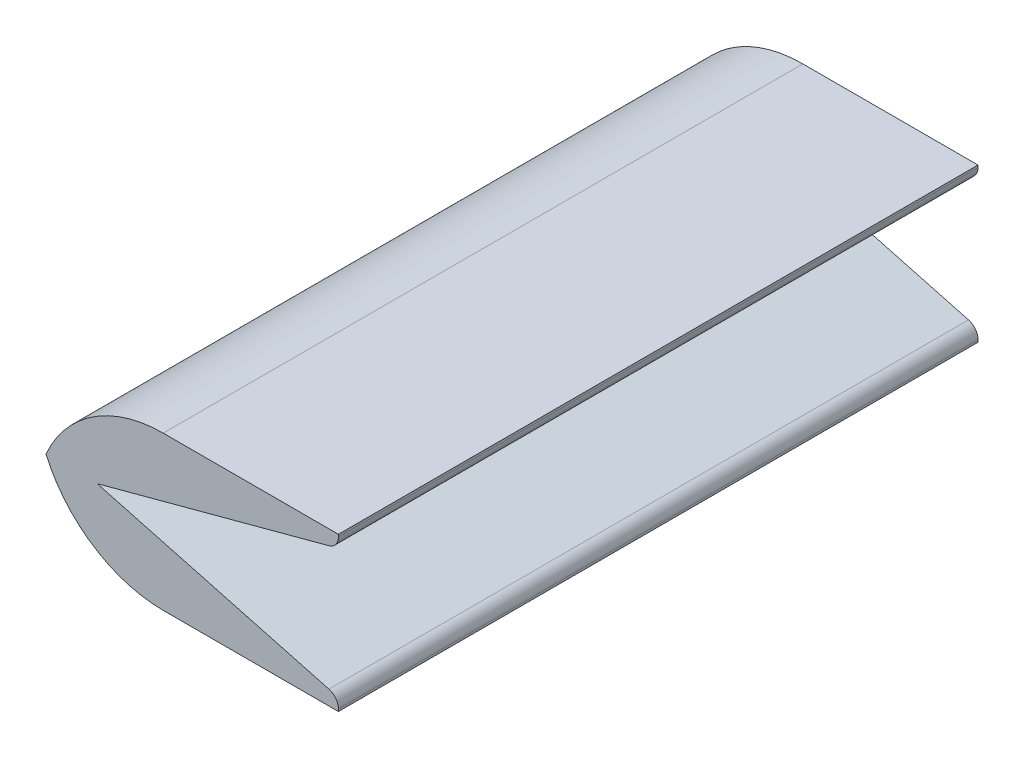
ISO-10303-21;
HEADER;
FILE_DESCRIPTION(('STEP AP214'),'2;1');
FILE_NAME('part.step','',(''),(''),'','','');
FILE_SCHEMA(('AUTOMOTIVE_DESIGN { 1 0 10303 214 1 1 1 1 }'));
ENDSEC;
DATA;
#1=APPLICATION_CONTEXT('core data for automotive mechanical design processes');
#2=APPLICATION_PROTOCOL_DEFINITION('international standard','automotive_design',2000,#1);
#3=PRODUCT_CONTEXT('',#1,'mechanical');
#4=PRODUCT('Part','Part','',(#3));
#5=PRODUCT_RELATED_PRODUCT_CATEGORY('part','',(#4));
#6=PRODUCT_DEFINITION_FORMATION('','',#4);
#7=PRODUCT_DEFINITION_CONTEXT('part definition',#1,'design');
#8=PRODUCT_DEFINITION('design','',#6,#7);
#9=PRODUCT_DEFINITION_SHAPE('','',#8);
#10=(LENGTH_UNIT() NAMED_UNIT(*) SI_UNIT(.MILLI.,.METRE.));
#11=(NAMED_UNIT(*) PLANE_ANGLE_UNIT() SI_UNIT($,.RADIAN.));
#12=(NAMED_UNIT(*) SI_UNIT($,.STERADIAN.) SOLID_ANGLE_UNIT());
#13=UNCERTAINTY_MEASURE_WITH_UNIT(LENGTH_MEASURE(1.E-05),#10,'distance_accuracy_value','');
#14=(GEOMETRIC_REPRESENTATION_CONTEXT(3) GLOBAL_UNCERTAINTY_ASSIGNED_CONTEXT((#13)) GLOBAL_UNIT_ASSIGNED_CONTEXT((#10,
#11,#12)) REPRESENTATION_CONTEXT('',''));
#15=CARTESIAN_POINT('',(0.,0.,0.));
#16=DIRECTION('',(0.,0.,1.));
#17=DIRECTION('',(1.,0.,0.));
#18=AXIS2_PLACEMENT_3D('',#15,#16,#17);
#19=CARTESIAN_POINT('',(0.870590477448727,3.24908789442434,50.));
#20=DIRECTION('',(0.258819045102517,0.965925826289069,0.));
#21=DIRECTION('',(-0.965925826289069,0.258819045102517,0.));
#22=AXIS2_PLACEMENT_3D('',#19,#20,#21);
#23=PLANE('',#22);
#24=DIRECTION('',(0.965925826289069,-0.258819045102517,0.));
#25=VECTOR('',#24,1.);
#26=CARTESIAN_POINT('',(0.870590477448727,3.24908789442434,50.));
#27=LINE('',#26,#25);
#28=CARTESIAN_POINT('',(-1.93185165257819,4.,50.));
#29=VERTEX_POINT('',#28);
#30=CARTESIAN_POINT('',(16.1870222753782,-0.854937636757169,50.));
#31=VERTEX_POINT('',#30);
#32=EDGE_CURVE('E225',#29,#31,#27,.T.);
#33=ORIENTED_EDGE('',*,*,#32,.T.);
#34=DIRECTION('',(0.,0.,-1.));
#35=VECTOR('',#34,1.);
#36=CARTESIAN_POINT('',(16.1870222753782,-0.854937636757169,0.));
#37=LINE('',#36,#35);
#38=CARTESIAN_POINT('',(16.1870222753782,-0.854937636757169,0.));
#39=VERTEX_POINT('',#38);
#40=EDGE_CURVE('E284',#31,#39,#37,.T.);
#41=ORIENTED_EDGE('',*,*,#40,.T.);
#42=DIRECTION('',(0.965925826289069,-0.258819045102517,0.));
#43=VECTOR('',#42,1.);
#44=CARTESIAN_POINT('',(0.870590477448727,3.24908789442434,0.));
#45=LINE('',#44,#43);
#46=CARTESIAN_POINT('',(-1.93185165257819,4.,0.));
#47=VERTEX_POINT('',#46);
#48=EDGE_CURVE('E224',#47,#39,#45,.T.);
#49=ORIENTED_EDGE('',*,*,#48,.F.);
#50=DIRECTION('',(0.,0.,-1.));
#51=VECTOR('',#50,1.);
#52=CARTESIAN_POINT('',(-1.93185165257819,4.,50.));
#53=LINE('',#52,#51);
#54=CARTESIAN_POINT('',(-1.93185165257819,4.,17.5));
#55=VERTEX_POINT('',#54);
#56=EDGE_CURVE('E257',#55,#47,#53,.T.);
#57=ORIENTED_EDGE('',*,*,#56,.F.);
#58=DIRECTION('',(-0.965925826289069,0.258819045102517,0.));
#59=VECTOR('',#58,1.);
#60=CARTESIAN_POINT('',(0.870590477448727,3.24908789442434,17.5));
#61=LINE('',#60,#59);
#62=CARTESIAN_POINT('',(0.867186453098469,3.25000000000001,17.5));
#63=VERTEX_POINT('',#62);
#64=EDGE_CURVE('E205',#63,#55,#61,.T.);
#65=ORIENTED_EDGE('',*,*,#64,.F.);
#66=DIRECTION('',(0.,0.,-1.));
#67=VECTOR('',#66,1.);
#68=CARTESIAN_POINT('',(0.867186453098493,3.25,50.));
#69=LINE('',#68,#67);
#70=CARTESIAN_POINT('',(0.867186453098469,3.25000000000001,32.5));
#71=VERTEX_POINT('',#70);
#72=EDGE_CURVE('E213',#71,#63,#69,.T.);
#73=ORIENTED_EDGE('',*,*,#72,.F.);
#74=DIRECTION('',(-0.965925826289069,0.258819045102517,0.));
#75=VECTOR('',#74,1.);
#76=CARTESIAN_POINT('',(0.870590477448727,3.24908789442434,32.5));
#77=LINE('',#76,#75);
#78=CARTESIAN_POINT('',(-1.93185165257819,4.,32.5));
#79=VERTEX_POINT('',#78);
#80=EDGE_CURVE('E219',#71,#79,#77,.T.);
#81=ORIENTED_EDGE('',*,*,#80,.T.);
#82=EDGE_CURVE('E258',#29,#79,#53,.T.);
#83=ORIENTED_EDGE('',*,*,#82,.F.);
#84=EDGE_LOOP('',(#33,#41,#49,#57,#65,#73,#81,#83));
#85=FACE_BOUND('',#84,.T.);
#86=ADVANCED_FACE('F74',(#85),#23,.T.);
#87=CARTESIAN_POINT('',(-1.12940952255125,4.21501372071343,50.));
#88=DIRECTION('',(-0.258819045102518,0.965925826289069,0.));
#89=DIRECTION('',(-0.965925826289069,-0.258819045102518,0.));
#90=AXIS2_PLACEMENT_3D('',#87,#88,#89);
#91=PLANE('',#90);
#92=DIRECTION('',(0.965925826289069,0.258819045102518,0.));
#93=VECTOR('',#92,1.);
#94=CARTESIAN_POINT('',(-1.12940952255125,4.21501372071343,0.));
#95=LINE('',#94,#93);
#96=CARTESIAN_POINT('',(16.1870222753782,8.85493763675719,0.));
#97=VERTEX_POINT('',#96);
#98=EDGE_CURVE('E242',#47,#97,#95,.T.);
#99=ORIENTED_EDGE('',*,*,#98,.T.);
#100=DIRECTION('',(0.,0.,-1.));
#101=VECTOR('',#100,1.);
#102=CARTESIAN_POINT('',(16.1870222753782,8.85493763675719,50.));
#103=LINE('',#102,#101);
#104=CARTESIAN_POINT('',(16.1870222753782,8.85493763675719,50.));
#105=VERTEX_POINT('',#104);
#106=EDGE_CURVE('E12',#97,#105,#103,.F.);
#107=ORIENTED_EDGE('',*,*,#106,.T.);
#108=DIRECTION('',(0.965925826289069,0.258819045102518,0.));
#109=VECTOR('',#108,1.);
#110=CARTESIAN_POINT('',(-1.12940952255125,4.21501372071343,50.));
#111=LINE('',#110,#109);
#112=EDGE_CURVE('E228',#29,#105,#111,.T.);
#113=ORIENTED_EDGE('',*,*,#112,.F.);
#114=ORIENTED_EDGE('',*,*,#82,.T.);
#115=DIRECTION('',(-0.965925826289069,-0.258819045102518,0.));
#116=VECTOR('',#115,1.);
#117=CARTESIAN_POINT('',(-1.12940952255125,4.21501372071343,32.5));
#118=LINE('',#117,#116);
#119=CARTESIAN_POINT('',(0.867186453098504,4.75,32.5));
#120=VERTEX_POINT('',#119);
#121=EDGE_CURVE('E211',#120,#79,#118,.T.);
#122=ORIENTED_EDGE('',*,*,#121,.F.);
#123=DIRECTION('',(0.,0.,1.));
#124=VECTOR('',#123,1.);
#125=CARTESIAN_POINT('',(0.867186453098506,4.75,50.));
#126=LINE('',#125,#124);
#127=CARTESIAN_POINT('',(0.867186453098477,4.75,17.5));
#128=VERTEX_POINT('',#127);
#129=EDGE_CURVE('E192',#128,#120,#126,.T.);
#130=ORIENTED_EDGE('',*,*,#129,.F.);
#131=DIRECTION('',(-0.965925826289069,-0.258819045102518,0.));
#132=VECTOR('',#131,1.);
#133=CARTESIAN_POINT('',(-1.12940952255125,4.21501372071343,17.5));
#134=LINE('',#133,#132);
#135=EDGE_CURVE('E202',#128,#55,#134,.T.);
#136=ORIENTED_EDGE('',*,*,#135,.T.);
#137=ORIENTED_EDGE('',*,*,#56,.T.);
#138=EDGE_LOOP('',(#99,#107,#113,#114,#122,#130,#136,#137));
#139=FACE_BOUND('',#138,.T.);
#140=ADVANCED_FACE('F209',(#139),#91,.F.);
#141=CARTESIAN_POINT('',(0.,0.,0.));
#142=DIRECTION('',(0.,0.,1.));
#143=DIRECTION('',(1.,0.,0.));
#144=AXIS2_PLACEMENT_3D('',#141,#142,#143);
#145=PLANE('',#144);
#146=ORIENTED_EDGE('',*,*,#48,.T.);
#147=CARTESIAN_POINT('',(15.9282032302757,-1.82086346304624,0.));
#148=DIRECTION('',(0.,0.,1.));
#149=DIRECTION('',(1.,0.,0.));
#150=AXIS2_PLACEMENT_3D('',#147,#148,#149);
#151=CIRCLE('',#150,1.);
#152=CARTESIAN_POINT('',(16.9282032302757,-1.82086346304624,0.));
#153=VERTEX_POINT('',#152);
#154=EDGE_CURVE('E289',#39,#153,#151,.F.);
#155=ORIENTED_EDGE('',*,*,#154,.T.);
#156=DIRECTION('',(0.,1.,0.));
#157=VECTOR('',#156,1.);
#158=CARTESIAN_POINT('',(16.9282032302757,0.,0.));
#159=LINE('',#158,#157);
#160=CARTESIAN_POINT('',(16.9282032302757,-2.,0.));
#161=VERTEX_POINT('',#160);
#162=EDGE_CURVE('E229',#161,#153,#159,.T.);
#163=ORIENTED_EDGE('',*,*,#162,.F.);
#164=DIRECTION('',(-1.,0.,0.));
#165=VECTOR('',#164,1.);
#166=CARTESIAN_POINT('',(0.,-2.,0.));
#167=LINE('',#166,#165);
#168=CARTESIAN_POINT('',(3.23329973733349,-2.,0.));
#169=VERTEX_POINT('',#168);
#170=EDGE_CURVE('E249',#161,#169,#167,.T.);
#171=ORIENTED_EDGE('',*,*,#170,.T.);
#172=CARTESIAN_POINT('',(3.23329973733349,8.,0.));
#173=DIRECTION('',(0.,0.,1.));
#174=DIRECTION('',(1.,0.,0.));
#175=AXIS2_PLACEMENT_3D('',#172,#173,#174);
#176=CIRCLE('',#175,10.);
#177=CARTESIAN_POINT('',(-5.93185165257819,4.,0.));
#178=VERTEX_POINT('',#177);
#179=EDGE_CURVE('E274',#169,#178,#176,.F.);
#180=ORIENTED_EDGE('',*,*,#179,.T.);
#181=CARTESIAN_POINT('',(3.23329973733349,0.,0.));
#182=DIRECTION('',(0.,0.,1.));
#183=DIRECTION('',(1.,0.,0.));
#184=AXIS2_PLACEMENT_3D('',#181,#182,#183);
#185=CIRCLE('',#184,10.);
#186=CARTESIAN_POINT('',(3.23329973733349,10.,0.));
#187=VERTEX_POINT('',#186);
#188=EDGE_CURVE('E265',#178,#187,#185,.F.);
#189=ORIENTED_EDGE('',*,*,#188,.T.);
#190=DIRECTION('',(-1.,0.,0.));
#191=VECTOR('',#190,1.);
#192=CARTESIAN_POINT('',(0.,10.,0.));
#193=LINE('',#192,#191);
#194=CARTESIAN_POINT('',(16.9282032302757,10.,0.));
#195=VERTEX_POINT('',#194);
#196=EDGE_CURVE('E246',#195,#187,#193,.T.);
#197=ORIENTED_EDGE('',*,*,#196,.F.);
#198=CARTESIAN_POINT('',(16.9282032302757,9.82086346304625,0.));
#199=VERTEX_POINT('',#198);
#200=EDGE_CURVE('E244',#199,#195,#159,.T.);
#201=ORIENTED_EDGE('',*,*,#200,.F.);
#202=CARTESIAN_POINT('',(15.9282032302757,9.82086346304625,0.));
#203=DIRECTION('',(0.,0.,1.));
#204=DIRECTION('',(1.,0.,0.));
#205=AXIS2_PLACEMENT_3D('',#202,#203,#204);
#206=CIRCLE('',#205,1.);
#207=EDGE_CURVE('E287',#199,#97,#206,.F.);
#208=ORIENTED_EDGE('',*,*,#207,.T.);
#209=ORIENTED_EDGE('',*,*,#98,.F.);
#210=EDGE_LOOP('',(#146,#155,#163,#171,#180,#189,#197,#201,#208,#209));
#211=FACE_BOUND('',#210,.T.);
#212=ADVANCED_FACE('F304',(#211),#145,.F.);
#213=CARTESIAN_POINT('',(0.,-2.,50.));
#214=DIRECTION('',(0.,-1.,0.));
#215=DIRECTION('',(1.,0.,0.));
#216=AXIS2_PLACEMENT_3D('',#213,#214,#215);
#217=PLANE('',#216);
#218=DIRECTION('',(-1.,0.,0.));
#219=VECTOR('',#218,1.);
#220=CARTESIAN_POINT('',(0.,-2.,50.));
#221=LINE('',#220,#219);
#222=CARTESIAN_POINT('',(16.9282032302757,-2.,50.));
#223=VERTEX_POINT('',#222);
#224=CARTESIAN_POINT('',(3.23329973733349,-2.,50.));
#225=VERTEX_POINT('',#224);
#226=EDGE_CURVE('E237',#223,#225,#221,.T.);
#227=ORIENTED_EDGE('',*,*,#226,.T.);
#228=DIRECTION('',(0.,0.,-1.));
#229=VECTOR('',#228,1.);
#230=CARTESIAN_POINT('',(3.23329973733349,-2.,0.));
#231=LINE('',#230,#229);
#232=EDGE_CURVE('E271',#225,#169,#231,.T.);
#233=ORIENTED_EDGE('',*,*,#232,.T.);
#234=ORIENTED_EDGE('',*,*,#170,.F.);
#235=DIRECTION('',(0.,0.,-1.));
#236=VECTOR('',#235,1.);
#237=CARTESIAN_POINT('',(16.9282032302757,-2.,50.));
#238=LINE('',#237,#236);
#239=EDGE_CURVE('E252',#223,#161,#238,.T.);
#240=ORIENTED_EDGE('',*,*,#239,.F.);
#241=EDGE_LOOP('',(#227,#233,#234,#240));
#242=FACE_BOUND('',#241,.T.);
#243=ADVANCED_FACE('F324',(#242),#217,.T.);
#244=CARTESIAN_POINT('',(0.,10.,50.));
#245=DIRECTION('',(0.,-1.,0.));
#246=DIRECTION('',(0.,0.,-1.));
#247=AXIS2_PLACEMENT_3D('',#244,#245,#246);
#248=PLANE('',#247);
#249=ORIENTED_EDGE('',*,*,#196,.T.);
#250=DIRECTION('',(0.,0.,1.));
#251=VECTOR('',#250,1.);
#252=CARTESIAN_POINT('',(3.23329973733349,10.,50.));
#253=LINE('',#252,#251);
#254=CARTESIAN_POINT('',(3.23329973733349,10.,50.));
#255=VERTEX_POINT('',#254);
#256=EDGE_CURVE('E267',#187,#255,#253,.T.);
#257=ORIENTED_EDGE('',*,*,#256,.T.);
#258=DIRECTION('',(-1.,0.,0.));
#259=VECTOR('',#258,1.);
#260=CARTESIAN_POINT('',(0.,10.,50.));
#261=LINE('',#260,#259);
#262=CARTESIAN_POINT('',(16.9282032302757,10.,50.));
#263=VERTEX_POINT('',#262);
#264=EDGE_CURVE('E233',#263,#255,#261,.T.);
#265=ORIENTED_EDGE('',*,*,#264,.F.);
#266=DIRECTION('',(0.,0.,-1.));
#267=VECTOR('',#266,1.);
#268=CARTESIAN_POINT('',(16.9282032302757,10.,50.));
#269=LINE('',#268,#267);
#270=EDGE_CURVE('E254',#263,#195,#269,.T.);
#271=ORIENTED_EDGE('',*,*,#270,.T.);
#272=EDGE_LOOP('',(#249,#257,#265,#271));
#273=FACE_BOUND('',#272,.T.);
#274=ADVANCED_FACE('F309',(#273),#248,.F.);
#275=CARTESIAN_POINT('',(0.,0.,50.));
#276=DIRECTION('',(0.,0.,1.));
#277=DIRECTION('',(1.,0.,0.));
#278=AXIS2_PLACEMENT_3D('',#275,#276,#277);
#279=PLANE('',#278);
#280=DIRECTION('',(0.,1.,0.));
#281=VECTOR('',#280,1.);
#282=CARTESIAN_POINT('',(16.9282032302757,0.,50.));
#283=LINE('',#282,#281);
#284=CARTESIAN_POINT('',(16.9282032302757,-1.82086346304624,50.));
#285=VERTEX_POINT('',#284);
#286=EDGE_CURVE('E234',#223,#285,#283,.T.);
#287=ORIENTED_EDGE('',*,*,#286,.T.);
#288=CARTESIAN_POINT('',(15.9282032302757,-1.82086346304624,50.));
#289=DIRECTION('',(0.,0.,1.));
#290=DIRECTION('',(1.,0.,0.));
#291=AXIS2_PLACEMENT_3D('',#288,#289,#290);
#292=CIRCLE('',#291,1.);
#293=EDGE_CURVE('E294',#285,#31,#292,.T.);
#294=ORIENTED_EDGE('',*,*,#293,.T.);
#295=ORIENTED_EDGE('',*,*,#32,.F.);
#296=ORIENTED_EDGE('',*,*,#112,.T.);
#297=CARTESIAN_POINT('',(15.9282032302757,9.82086346304625,50.));
#298=DIRECTION('',(0.,0.,1.));
#299=DIRECTION('',(1.,0.,0.));
#300=AXIS2_PLACEMENT_3D('',#297,#298,#299);
#301=CIRCLE('',#300,1.);
#302=CARTESIAN_POINT('',(16.9282032302757,9.82086346304625,50.));
#303=VERTEX_POINT('',#302);
#304=EDGE_CURVE('E89',#105,#303,#301,.T.);
#305=ORIENTED_EDGE('',*,*,#304,.T.);
#306=EDGE_CURVE('E231',#303,#263,#283,.T.);
#307=ORIENTED_EDGE('',*,*,#306,.T.);
#308=ORIENTED_EDGE('',*,*,#264,.T.);
#309=CARTESIAN_POINT('',(3.23329973733349,0.,50.));
#310=DIRECTION('',(0.,0.,1.));
#311=DIRECTION('',(1.,0.,0.));
#312=AXIS2_PLACEMENT_3D('',#309,#310,#311);
#313=CIRCLE('',#312,10.);
#314=CARTESIAN_POINT('',(-5.93185165257819,4.,50.));
#315=VERTEX_POINT('',#314);
#316=EDGE_CURVE('E269',#255,#315,#313,.T.);
#317=ORIENTED_EDGE('',*,*,#316,.T.);
#318=CARTESIAN_POINT('',(3.23329973733349,8.,50.));
#319=DIRECTION('',(0.,0.,1.));
#320=DIRECTION('',(1.,0.,0.));
#321=AXIS2_PLACEMENT_3D('',#318,#319,#320);
#322=CIRCLE('',#321,10.);
#323=EDGE_CURVE('E282',#315,#225,#322,.T.);
#324=ORIENTED_EDGE('',*,*,#323,.T.);
#325=ORIENTED_EDGE('',*,*,#226,.F.);
#326=EDGE_LOOP('',(#287,#294,#295,#296,#305,#307,#308,#317,#324,#325));
#327=FACE_BOUND('',#326,.T.);
#328=ADVANCED_FACE('F319',(#327),#279,.T.);
#329=CARTESIAN_POINT('',(16.9282032302757,0.,50.));
#330=DIRECTION('',(-1.,0.,0.));
#331=DIRECTION('',(0.,0.,1.));
#332=AXIS2_PLACEMENT_3D('',#329,#330,#331);
#333=PLANE('',#332);
#334=ORIENTED_EDGE('',*,*,#162,.T.);
#335=DIRECTION('',(0.,0.,-1.));
#336=VECTOR('',#335,1.);
#337=CARTESIAN_POINT('',(16.9282032302757,-1.82086346304624,50.));
#338=LINE('',#337,#336);
#339=EDGE_CURVE('E291',#153,#285,#338,.F.);
#340=ORIENTED_EDGE('',*,*,#339,.T.);
#341=ORIENTED_EDGE('',*,*,#286,.F.);
#342=ORIENTED_EDGE('',*,*,#239,.T.);
#343=EDGE_LOOP('',(#334,#340,#341,#342));
#344=FACE_BOUND('',#343,.T.);
#345=ADVANCED_FACE('F333',(#344),#333,.F.);
#346=ORIENTED_EDGE('',*,*,#306,.F.);
#347=DIRECTION('',(0.,0.,-1.));
#348=VECTOR('',#347,1.);
#349=CARTESIAN_POINT('',(16.9282032302757,9.82086346304625,50.));
#350=LINE('',#349,#348);
#351=EDGE_CURVE('E82',#303,#199,#350,.T.);
#352=ORIENTED_EDGE('',*,*,#351,.T.);
#353=ORIENTED_EDGE('',*,*,#200,.T.);
#354=ORIENTED_EDGE('',*,*,#270,.F.);
#355=EDGE_LOOP('',(#346,#352,#353,#354));
#356=FACE_BOUND('',#355,.T.);
#357=ADVANCED_FACE('F299',(#356),#333,.F.);
#358=CARTESIAN_POINT('',(-5.93186365257819,4.75,0.));
#359=DIRECTION('',(0.,-1.,0.));
#360=DIRECTION('',(0.,0.,-1.));
#361=AXIS2_PLACEMENT_3D('',#358,#359,#360);
#362=PLANE('',#361);
#363=DIRECTION('',(1.,0.,0.));
#364=VECTOR('',#363,1.);
#365=CARTESIAN_POINT('',(-5.93186365257819,4.75,32.5));
#366=LINE('',#365,#364);
#367=CARTESIAN_POINT('',(-5.56655821606553,4.75,32.5));
#368=VERTEX_POINT('',#367);
#369=EDGE_CURVE('E198',#368,#120,#366,.T.);
#370=ORIENTED_EDGE('',*,*,#369,.F.);
#371=DIRECTION('',(0.,0.,1.));
#372=VECTOR('',#371,1.);
#373=CARTESIAN_POINT('',(-5.56655821606553,4.75,32.5));
#374=LINE('',#373,#372);
#375=CARTESIAN_POINT('',(-5.56655821606553,4.75,17.5));
#376=VERTEX_POINT('',#375);
#377=EDGE_CURVE('E195',#368,#376,#374,.F.);
#378=ORIENTED_EDGE('',*,*,#377,.T.);
#379=DIRECTION('',(1.,0.,0.));
#380=VECTOR('',#379,1.);
#381=CARTESIAN_POINT('',(-5.93186365257819,4.75,17.5));
#382=LINE('',#381,#380);
#383=EDGE_CURVE('E187',#376,#128,#382,.T.);
#384=ORIENTED_EDGE('',*,*,#383,.T.);
#385=ORIENTED_EDGE('',*,*,#129,.T.);
#386=EDGE_LOOP('',(#370,#378,#384,#385));
#387=FACE_BOUND('',#386,.T.);
#388=ADVANCED_FACE('F190',(#387),#362,.T.);
#389=CARTESIAN_POINT('',(-5.93186365257819,3.25,0.));
#390=DIRECTION('',(0.,-1.,0.));
#391=DIRECTION('',(0.,0.,-1.));
#392=AXIS2_PLACEMENT_3D('',#389,#390,#391);
#393=PLANE('',#392);
#394=DIRECTION('',(1.,0.,0.));
#395=VECTOR('',#394,1.);
#396=CARTESIAN_POINT('',(-5.93186365257819,3.25,17.5));
#397=LINE('',#396,#395);
#398=CARTESIAN_POINT('',(-5.56655821606554,3.25,17.5));
#399=VERTEX_POINT('',#398);
#400=EDGE_CURVE('E199',#399,#63,#397,.T.);
#401=ORIENTED_EDGE('',*,*,#400,.F.);
#402=DIRECTION('',(0.,0.,1.));
#403=VECTOR('',#402,1.);
#404=CARTESIAN_POINT('',(-5.56655821606554,3.25,17.5));
#405=LINE('',#404,#403);
#406=CARTESIAN_POINT('',(-5.56655821606553,3.25,32.5));
#407=VERTEX_POINT('',#406);
#408=EDGE_CURVE('E278',#399,#407,#405,.T.);
#409=ORIENTED_EDGE('',*,*,#408,.T.);
#410=DIRECTION('',(1.,0.,0.));
#411=VECTOR('',#410,1.);
#412=CARTESIAN_POINT('',(-5.93186365257819,3.25,32.5));
#413=LINE('',#412,#411);
#414=EDGE_CURVE('E207',#407,#71,#413,.T.);
#415=ORIENTED_EDGE('',*,*,#414,.T.);
#416=ORIENTED_EDGE('',*,*,#72,.T.);
#417=EDGE_LOOP('',(#401,#409,#415,#416));
#418=FACE_BOUND('',#417,.T.);
#419=ADVANCED_FACE('F382',(#418),#393,.F.);
#420=CARTESIAN_POINT('',(-5.93186365257819,0.,32.5));
#421=DIRECTION('',(0.,0.,-1.));
#422=DIRECTION('',(-1.,0.,0.));
#423=AXIS2_PLACEMENT_3D('',#420,#421,#422);
#424=PLANE('',#423);
#425=ORIENTED_EDGE('',*,*,#414,.F.);
#426=CARTESIAN_POINT('',(3.23329973733349,8.,32.5));
#427=DIRECTION('',(0.,0.,-1.));
#428=DIRECTION('',(-1.,0.,0.));
#429=AXIS2_PLACEMENT_3D('',#426,#427,#428);
#430=CIRCLE('',#429,10.);
#431=CARTESIAN_POINT('',(-5.93185165257819,4.,32.5));
#432=VERTEX_POINT('',#431);
#433=EDGE_CURVE('E280',#407,#432,#430,.T.);
#434=ORIENTED_EDGE('',*,*,#433,.T.);
#435=CARTESIAN_POINT('',(3.23329973733349,0.,32.5));
#436=DIRECTION('',(0.,0.,-1.));
#437=DIRECTION('',(-1.,0.,0.));
#438=AXIS2_PLACEMENT_3D('',#435,#436,#437);
#439=CIRCLE('',#438,10.);
#440=EDGE_CURVE('E260',#432,#368,#439,.T.);
#441=ORIENTED_EDGE('',*,*,#440,.T.);
#442=ORIENTED_EDGE('',*,*,#369,.T.);
#443=ORIENTED_EDGE('',*,*,#121,.T.);
#444=ORIENTED_EDGE('',*,*,#80,.F.);
#445=EDGE_LOOP('',(#425,#434,#441,#442,#443,#444));
#446=FACE_BOUND('',#445,.T.);
#447=ADVANCED_FACE('F374',(#446),#424,.T.);
#448=CARTESIAN_POINT('',(-5.93186365257819,0.,17.5));
#449=DIRECTION('',(0.,0.,-1.));
#450=DIRECTION('',(-1.,0.,0.));
#451=AXIS2_PLACEMENT_3D('',#448,#449,#450);
#452=PLANE('',#451);
#453=CARTESIAN_POINT('',(3.23329973733349,0.,17.5));
#454=DIRECTION('',(0.,0.,-1.));
#455=DIRECTION('',(-1.,0.,0.));
#456=AXIS2_PLACEMENT_3D('',#453,#454,#455);
#457=CIRCLE('',#456,10.);
#458=CARTESIAN_POINT('',(-5.93185165257819,4.,17.5));
#459=VERTEX_POINT('',#458);
#460=EDGE_CURVE('E263',#376,#459,#457,.F.);
#461=ORIENTED_EDGE('',*,*,#460,.T.);
#462=CARTESIAN_POINT('',(3.23329973733349,8.,17.5));
#463=DIRECTION('',(0.,0.,-1.));
#464=DIRECTION('',(-1.,0.,0.));
#465=AXIS2_PLACEMENT_3D('',#462,#463,#464);
#466=CIRCLE('',#465,10.);
#467=EDGE_CURVE('E276',#459,#399,#466,.F.);
#468=ORIENTED_EDGE('',*,*,#467,.T.);
#469=ORIENTED_EDGE('',*,*,#400,.T.);
#470=ORIENTED_EDGE('',*,*,#64,.T.);
#471=ORIENTED_EDGE('',*,*,#135,.F.);
#472=ORIENTED_EDGE('',*,*,#383,.F.);
#473=EDGE_LOOP('',(#461,#468,#469,#470,#471,#472));
#474=FACE_BOUND('',#473,.T.);
#475=ADVANCED_FACE('F203',(#474),#452,.F.);
#476=CARTESIAN_POINT('',(3.23329973733349,0.,0.));
#477=DIRECTION('',(0.,0.,1.));
#478=DIRECTION('',(1.,0.,0.));
#479=AXIS2_PLACEMENT_3D('',#476,#477,#478);
#480=CYLINDRICAL_SURFACE('',#479,10.);
#481=ORIENTED_EDGE('',*,*,#316,.F.);
#482=ORIENTED_EDGE('',*,*,#256,.F.);
#483=ORIENTED_EDGE('',*,*,#188,.F.);
#484=DIRECTION('',(0.,0.,1.));
#485=VECTOR('',#484,1.);
#486=CARTESIAN_POINT('',(-5.93185165257819,4.,0.));
#487=LINE('',#486,#485);
#488=EDGE_CURVE('E216',#178,#459,#487,.T.);
#489=ORIENTED_EDGE('',*,*,#488,.T.);
#490=ORIENTED_EDGE('',*,*,#460,.F.);
#491=ORIENTED_EDGE('',*,*,#377,.F.);
#492=ORIENTED_EDGE('',*,*,#440,.F.);
#493=EDGE_CURVE('E212',#432,#315,#487,.T.);
#494=ORIENTED_EDGE('',*,*,#493,.T.);
#495=EDGE_LOOP('',(#481,#482,#483,#489,#490,#491,#492,#494));
#496=FACE_BOUND('',#495,.T.);
#497=ADVANCED_FACE('F313',(#496),#480,.T.);
#498=CARTESIAN_POINT('',(3.23329973733349,8.,0.));
#499=DIRECTION('',(0.,0.,1.));
#500=DIRECTION('',(1.,0.,0.));
#501=AXIS2_PLACEMENT_3D('',#498,#499,#500);
#502=CYLINDRICAL_SURFACE('',#501,10.);
#503=ORIENTED_EDGE('',*,*,#467,.F.);
#504=ORIENTED_EDGE('',*,*,#488,.F.);
#505=ORIENTED_EDGE('',*,*,#179,.F.);
#506=ORIENTED_EDGE('',*,*,#232,.F.);
#507=ORIENTED_EDGE('',*,*,#323,.F.);
#508=ORIENTED_EDGE('',*,*,#493,.F.);
#509=ORIENTED_EDGE('',*,*,#433,.F.);
#510=ORIENTED_EDGE('',*,*,#408,.F.);
#511=EDGE_LOOP('',(#503,#504,#505,#506,#507,#508,#509,#510));
#512=FACE_BOUND('',#511,.T.);
#513=ADVANCED_FACE('F328',(#512),#502,.T.);
#514=CARTESIAN_POINT('',(15.9282032302757,-1.82086346304624,50.));
#515=DIRECTION('',(0.,0.,1.));
#516=DIRECTION('',(1.,0.,0.));
#517=AXIS2_PLACEMENT_3D('',#514,#515,#516);
#518=CYLINDRICAL_SURFACE('',#517,1.);
#519=ORIENTED_EDGE('',*,*,#293,.F.);
#520=ORIENTED_EDGE('',*,*,#339,.F.);
#521=ORIENTED_EDGE('',*,*,#154,.F.);
#522=ORIENTED_EDGE('',*,*,#40,.F.);
#523=EDGE_LOOP('',(#519,#520,#521,#522));
#524=FACE_BOUND('',#523,.T.);
#525=ADVANCED_FACE('F336',(#524),#518,.T.);
#526=CARTESIAN_POINT('',(15.9282032302757,9.82086346304625,50.));
#527=DIRECTION('',(0.,0.,-1.));
#528=DIRECTION('',(-1.,0.,0.));
#529=AXIS2_PLACEMENT_3D('',#526,#527,#528);
#530=CYLINDRICAL_SURFACE('',#529,1.);
#531=ORIENTED_EDGE('',*,*,#304,.F.);
#532=ORIENTED_EDGE('',*,*,#106,.F.);
#533=ORIENTED_EDGE('',*,*,#207,.F.);
#534=ORIENTED_EDGE('',*,*,#351,.F.);
#535=EDGE_LOOP('',(#531,#532,#533,#534));
#536=FACE_BOUND('',#535,.T.);
#537=ADVANCED_FACE('F76',(#536),#530,.T.);
#538=CLOSED_SHELL('',(#86,#140,#212,#243,#274,#328,#345,#357,#388,#419,#447,#475,#497,#513,#525,#537));
#539=MANIFOLD_SOLID_BREP('B2',#538);
#540=ADVANCED_BREP_SHAPE_REPRESENTATION('',(#18,#539),#14);
#541=SHAPE_DEFINITION_REPRESENTATION(#9,#540);
ENDSEC;
END-ISO-10303-21;
